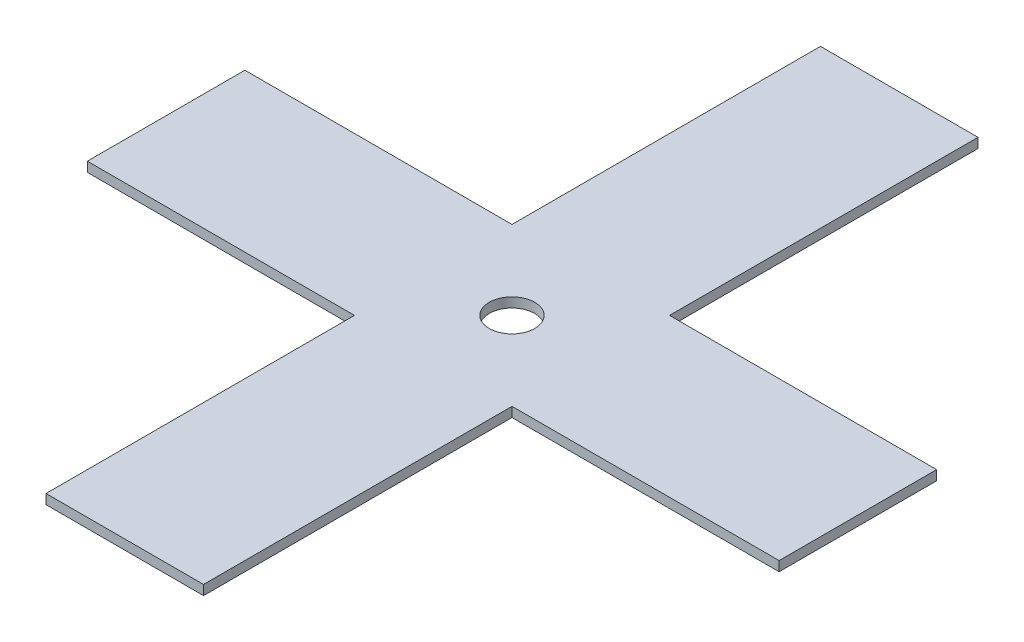
ISO-10303-21;
HEADER;
FILE_DESCRIPTION(('STEP AP214'),'2;1');
FILE_NAME('part.step','',(''),(''),'','','');
FILE_SCHEMA(('AUTOMOTIVE_DESIGN { 1 0 10303 214 1 1 1 1 }'));
ENDSEC;
DATA;
#1=APPLICATION_CONTEXT('core data for automotive mechanical design processes');
#2=APPLICATION_PROTOCOL_DEFINITION('international standard','automotive_design',2000,#1);
#3=PRODUCT_CONTEXT('',#1,'mechanical');
#4=PRODUCT('Part','Part','',(#3));
#5=PRODUCT_RELATED_PRODUCT_CATEGORY('part','',(#4));
#6=PRODUCT_DEFINITION_FORMATION('','',#4);
#7=PRODUCT_DEFINITION_CONTEXT('part definition',#1,'design');
#8=PRODUCT_DEFINITION('design','',#6,#7);
#9=PRODUCT_DEFINITION_SHAPE('','',#8);
#10=(LENGTH_UNIT() NAMED_UNIT(*) SI_UNIT(.MILLI.,.METRE.));
#11=(NAMED_UNIT(*) PLANE_ANGLE_UNIT() SI_UNIT($,.RADIAN.));
#12=(NAMED_UNIT(*) SI_UNIT($,.STERADIAN.) SOLID_ANGLE_UNIT());
#13=UNCERTAINTY_MEASURE_WITH_UNIT(LENGTH_MEASURE(1.E-05),#10,'distance_accuracy_value','');
#14=(GEOMETRIC_REPRESENTATION_CONTEXT(3) GLOBAL_UNCERTAINTY_ASSIGNED_CONTEXT((#13)) GLOBAL_UNIT_ASSIGNED_CONTEXT((#10,
#11,#12)) REPRESENTATION_CONTEXT('',''));
#15=CARTESIAN_POINT('',(0.,0.,0.));
#16=DIRECTION('',(0.,0.,1.));
#17=DIRECTION('',(1.,0.,0.));
#18=AXIS2_PLACEMENT_3D('',#15,#16,#17);
#19=CARTESIAN_POINT('',(0.,1.175,0.));
#20=DIRECTION('',(0.,-1.,0.));
#21=DIRECTION('',(0.,0.,-1.));
#22=AXIS2_PLACEMENT_3D('',#19,#20,#21);
#23=PLANE('',#22);
#24=DIRECTION('',(1.,0.,0.));
#25=VECTOR('',#24,1.);
#26=CARTESIAN_POINT('',(19.05,1.175,0.));
#27=LINE('',#26,#25);
#28=CARTESIAN_POINT('',(0.,1.175,0.));
#29=VERTEX_POINT('',#28);
#30=CARTESIAN_POINT('',(19.05,1.175,0.));
#31=VERTEX_POINT('',#30);
#32=EDGE_CURVE('E177',#29,#31,#27,.T.);
#33=ORIENTED_EDGE('',*,*,#32,.T.);
#34=DIRECTION('',(0.,0.,-1.));
#35=VECTOR('',#34,1.);
#36=CARTESIAN_POINT('',(19.05,1.175,-37.3));
#37=LINE('',#36,#35);
#38=CARTESIAN_POINT('',(19.05,1.175,-37.3));
#39=VERTEX_POINT('',#38);
#40=EDGE_CURVE('E105',#31,#39,#37,.T.);
#41=ORIENTED_EDGE('',*,*,#40,.T.);
#42=DIRECTION('',(1.,0.,0.));
#43=VECTOR('',#42,1.);
#44=CARTESIAN_POINT('',(51.35,1.175,-37.3));
#45=LINE('',#44,#43);
#46=CARTESIAN_POINT('',(51.35,1.175,-37.3));
#47=VERTEX_POINT('',#46);
#48=EDGE_CURVE('E204',#39,#47,#45,.T.);
#49=ORIENTED_EDGE('',*,*,#48,.T.);
#50=DIRECTION('',(0.,0.,-1.));
#51=VECTOR('',#50,1.);
#52=CARTESIAN_POINT('',(51.35,1.175,-56.35));
#53=LINE('',#52,#51);
#54=CARTESIAN_POINT('',(51.35,1.175,-56.35));
#55=VERTEX_POINT('',#54);
#56=EDGE_CURVE('E223',#47,#55,#53,.T.);
#57=ORIENTED_EDGE('',*,*,#56,.T.);
#58=DIRECTION('',(-1.,0.,0.));
#59=VECTOR('',#58,1.);
#60=CARTESIAN_POINT('',(19.05,1.175,-56.35));
#61=LINE('',#60,#59);
#62=CARTESIAN_POINT('',(19.05,1.175,-56.35));
#63=VERTEX_POINT('',#62);
#64=EDGE_CURVE('E220',#55,#63,#61,.T.);
#65=ORIENTED_EDGE('',*,*,#64,.T.);
#66=DIRECTION('',(0.,0.,-1.));
#67=VECTOR('',#66,1.);
#68=CARTESIAN_POINT('',(19.05,1.175,-93.65));
#69=LINE('',#68,#67);
#70=CARTESIAN_POINT('',(19.05,1.175,-93.65));
#71=VERTEX_POINT('',#70);
#72=EDGE_CURVE('E222',#63,#71,#69,.T.);
#73=ORIENTED_EDGE('',*,*,#72,.T.);
#74=DIRECTION('',(-1.,0.,0.));
#75=VECTOR('',#74,1.);
#76=CARTESIAN_POINT('',(0.,1.175,-93.65));
#77=LINE('',#76,#75);
#78=CARTESIAN_POINT('',(0.,1.175,-93.65));
#79=VERTEX_POINT('',#78);
#80=EDGE_CURVE('E225',#71,#79,#77,.T.);
#81=ORIENTED_EDGE('',*,*,#80,.T.);
#82=DIRECTION('',(0.,0.,1.));
#83=VECTOR('',#82,1.);
#84=CARTESIAN_POINT('',(0.,1.175,-56.35));
#85=LINE('',#84,#83);
#86=CARTESIAN_POINT('',(0.,1.175,-56.35));
#87=VERTEX_POINT('',#86);
#88=EDGE_CURVE('E231',#79,#87,#85,.T.);
#89=ORIENTED_EDGE('',*,*,#88,.T.);
#90=DIRECTION('',(-1.,0.,0.));
#91=VECTOR('',#90,1.);
#92=CARTESIAN_POINT('',(-32.3,1.175,-56.35));
#93=LINE('',#92,#91);
#94=CARTESIAN_POINT('',(-32.3,1.175,-56.35));
#95=VERTEX_POINT('',#94);
#96=EDGE_CURVE('E136',#87,#95,#93,.T.);
#97=ORIENTED_EDGE('',*,*,#96,.T.);
#98=DIRECTION('',(0.,0.,1.));
#99=VECTOR('',#98,1.);
#100=CARTESIAN_POINT('',(-32.3,1.175,-37.3));
#101=LINE('',#100,#99);
#102=CARTESIAN_POINT('',(-32.3,1.175,-37.3));
#103=VERTEX_POINT('',#102);
#104=EDGE_CURVE('E130',#95,#103,#101,.T.);
#105=ORIENTED_EDGE('',*,*,#104,.T.);
#106=DIRECTION('',(1.,0.,0.));
#107=VECTOR('',#106,1.);
#108=CARTESIAN_POINT('',(0.,1.175,-37.3));
#109=LINE('',#108,#107);
#110=CARTESIAN_POINT('',(0.,1.175,-37.3));
#111=VERTEX_POINT('',#110);
#112=EDGE_CURVE('E134',#103,#111,#109,.T.);
#113=ORIENTED_EDGE('',*,*,#112,.T.);
#114=DIRECTION('',(0.,0.,1.));
#115=VECTOR('',#114,1.);
#116=CARTESIAN_POINT('',(0.,1.175,0.));
#117=LINE('',#116,#115);
#118=EDGE_CURVE('E50',#111,#29,#117,.T.);
#119=ORIENTED_EDGE('',*,*,#118,.T.);
#120=EDGE_LOOP('',(#33,#41,#49,#57,#65,#73,#81,#89,#97,#105,#113,#119));
#121=FACE_BOUND('',#120,.T.);
#122=CARTESIAN_POINT('',(9.525,1.175,-46.825));
#123=DIRECTION('',(0.,1.,0.));
#124=DIRECTION('',(0.,0.,1.));
#125=AXIS2_PLACEMENT_3D('',#122,#123,#124);
#126=CIRCLE('',#125,2.75);
#127=CARTESIAN_POINT('',(9.525,1.175,-44.075));
#128=VERTEX_POINT('',#127);
#129=EDGE_CURVE('E158',#128,#128,#126,.T.);
#130=ORIENTED_EDGE('',*,*,#129,.F.);
#131=EDGE_LOOP('',(#130));
#132=FACE_BOUND('',#131,.T.);
#133=ADVANCED_FACE('F33',(#121,#132),#23,.F.);
#134=CARTESIAN_POINT('',(0.,0.,0.));
#135=DIRECTION('',(0.,-1.,0.));
#136=DIRECTION('',(0.,0.,-1.));
#137=AXIS2_PLACEMENT_3D('',#134,#135,#136);
#138=PLANE('',#137);
#139=DIRECTION('',(1.,0.,0.));
#140=VECTOR('',#139,1.);
#141=CARTESIAN_POINT('',(19.05,0.,0.));
#142=LINE('',#141,#140);
#143=CARTESIAN_POINT('',(0.,0.,0.));
#144=VERTEX_POINT('',#143);
#145=CARTESIAN_POINT('',(19.05,0.,0.));
#146=VERTEX_POINT('',#145);
#147=EDGE_CURVE('E154',#144,#146,#142,.T.);
#148=ORIENTED_EDGE('',*,*,#147,.F.);
#149=DIRECTION('',(0.,0.,1.));
#150=VECTOR('',#149,1.);
#151=CARTESIAN_POINT('',(0.,0.,0.));
#152=LINE('',#151,#150);
#153=CARTESIAN_POINT('',(0.,0.,-37.3));
#154=VERTEX_POINT('',#153);
#155=EDGE_CURVE('E97',#154,#144,#152,.T.);
#156=ORIENTED_EDGE('',*,*,#155,.F.);
#157=DIRECTION('',(1.,0.,0.));
#158=VECTOR('',#157,1.);
#159=CARTESIAN_POINT('',(0.,0.,-37.3));
#160=LINE('',#159,#158);
#161=CARTESIAN_POINT('',(-32.3,0.,-37.3));
#162=VERTEX_POINT('',#161);
#163=EDGE_CURVE('E91',#162,#154,#160,.T.);
#164=ORIENTED_EDGE('',*,*,#163,.F.);
#165=DIRECTION('',(0.,0.,1.));
#166=VECTOR('',#165,1.);
#167=CARTESIAN_POINT('',(-32.3,0.,-37.3));
#168=LINE('',#167,#166);
#169=CARTESIAN_POINT('',(-32.3,0.,-56.35));
#170=VERTEX_POINT('',#169);
#171=EDGE_CURVE('E144',#170,#162,#168,.T.);
#172=ORIENTED_EDGE('',*,*,#171,.F.);
#173=DIRECTION('',(-1.,0.,0.));
#174=VECTOR('',#173,1.);
#175=CARTESIAN_POINT('',(-32.3,0.,-56.35));
#176=LINE('',#175,#174);
#177=CARTESIAN_POINT('',(0.,0.,-56.35));
#178=VERTEX_POINT('',#177);
#179=EDGE_CURVE('E172',#178,#170,#176,.T.);
#180=ORIENTED_EDGE('',*,*,#179,.F.);
#181=DIRECTION('',(0.,0.,1.));
#182=VECTOR('',#181,1.);
#183=CARTESIAN_POINT('',(0.,0.,-56.35));
#184=LINE('',#183,#182);
#185=CARTESIAN_POINT('',(0.,0.,-93.65));
#186=VERTEX_POINT('',#185);
#187=EDGE_CURVE('E170',#186,#178,#184,.T.);
#188=ORIENTED_EDGE('',*,*,#187,.F.);
#189=DIRECTION('',(-1.,0.,0.));
#190=VECTOR('',#189,1.);
#191=CARTESIAN_POINT('',(0.,0.,-93.65));
#192=LINE('',#191,#190);
#193=CARTESIAN_POINT('',(19.05,0.,-93.65));
#194=VERTEX_POINT('',#193);
#195=EDGE_CURVE('E168',#194,#186,#192,.T.);
#196=ORIENTED_EDGE('',*,*,#195,.F.);
#197=DIRECTION('',(0.,0.,-1.));
#198=VECTOR('',#197,1.);
#199=CARTESIAN_POINT('',(19.05,0.,-93.65));
#200=LINE('',#199,#198);
#201=CARTESIAN_POINT('',(19.05,0.,-56.35));
#202=VERTEX_POINT('',#201);
#203=EDGE_CURVE('E166',#202,#194,#200,.T.);
#204=ORIENTED_EDGE('',*,*,#203,.F.);
#205=DIRECTION('',(-1.,0.,0.));
#206=VECTOR('',#205,1.);
#207=CARTESIAN_POINT('',(19.05,0.,-56.35));
#208=LINE('',#207,#206);
#209=CARTESIAN_POINT('',(51.35,0.,-56.35));
#210=VERTEX_POINT('',#209);
#211=EDGE_CURVE('E164',#210,#202,#208,.T.);
#212=ORIENTED_EDGE('',*,*,#211,.F.);
#213=DIRECTION('',(0.,0.,-1.));
#214=VECTOR('',#213,1.);
#215=CARTESIAN_POINT('',(51.35,0.,-56.35));
#216=LINE('',#215,#214);
#217=CARTESIAN_POINT('',(51.35,0.,-37.3));
#218=VERTEX_POINT('',#217);
#219=EDGE_CURVE('E162',#218,#210,#216,.T.);
#220=ORIENTED_EDGE('',*,*,#219,.F.);
#221=DIRECTION('',(1.,0.,0.));
#222=VECTOR('',#221,1.);
#223=CARTESIAN_POINT('',(51.35,0.,-37.3));
#224=LINE('',#223,#222);
#225=CARTESIAN_POINT('',(19.05,0.,-37.3));
#226=VERTEX_POINT('',#225);
#227=EDGE_CURVE('E160',#226,#218,#224,.T.);
#228=ORIENTED_EDGE('',*,*,#227,.F.);
#229=DIRECTION('',(0.,0.,-1.));
#230=VECTOR('',#229,1.);
#231=CARTESIAN_POINT('',(19.05,0.,-37.3));
#232=LINE('',#231,#230);
#233=EDGE_CURVE('E157',#146,#226,#232,.T.);
#234=ORIENTED_EDGE('',*,*,#233,.F.);
#235=EDGE_LOOP('',(#148,#156,#164,#172,#180,#188,#196,#204,#212,#220,#228,#234));
#236=FACE_BOUND('',#235,.T.);
#237=CARTESIAN_POINT('',(9.525,0.,-46.825));
#238=DIRECTION('',(0.,1.,0.));
#239=DIRECTION('',(0.,0.,1.));
#240=AXIS2_PLACEMENT_3D('',#237,#238,#239);
#241=CIRCLE('',#240,2.75);
#242=CARTESIAN_POINT('',(9.525,0.,-44.075));
#243=VERTEX_POINT('',#242);
#244=EDGE_CURVE('E378',#243,#243,#241,.T.);
#245=ORIENTED_EDGE('',*,*,#244,.T.);
#246=EDGE_LOOP('',(#245));
#247=FACE_BOUND('',#246,.T.);
#248=ADVANCED_FACE('F208',(#236,#247),#138,.T.);
#249=CARTESIAN_POINT('',(19.05,1.175,0.));
#250=DIRECTION('',(0.,0.,-1.));
#251=DIRECTION('',(-1.,0.,0.));
#252=AXIS2_PLACEMENT_3D('',#249,#250,#251);
#253=PLANE('',#252);
#254=ORIENTED_EDGE('',*,*,#147,.T.);
#255=DIRECTION('',(0.,-1.,0.));
#256=VECTOR('',#255,1.);
#257=CARTESIAN_POINT('',(19.05,1.175,0.));
#258=LINE('',#257,#256);
#259=EDGE_CURVE('E11',#31,#146,#258,.T.);
#260=ORIENTED_EDGE('',*,*,#259,.F.);
#261=ORIENTED_EDGE('',*,*,#32,.F.);
#262=DIRECTION('',(0.,-1.,0.));
#263=VECTOR('',#262,1.);
#264=CARTESIAN_POINT('',(0.,1.175,0.));
#265=LINE('',#264,#263);
#266=EDGE_CURVE('E150',#29,#144,#265,.T.);
#267=ORIENTED_EDGE('',*,*,#266,.T.);
#268=EDGE_LOOP('',(#254,#260,#261,#267));
#269=FACE_BOUND('',#268,.T.);
#270=ADVANCED_FACE('F35',(#269),#253,.F.);
#271=CARTESIAN_POINT('',(19.05,1.175,-37.3));
#272=DIRECTION('',(-1.,0.,0.));
#273=DIRECTION('',(0.,0.,1.));
#274=AXIS2_PLACEMENT_3D('',#271,#272,#273);
#275=PLANE('',#274);
#276=ORIENTED_EDGE('',*,*,#233,.T.);
#277=DIRECTION('',(0.,-1.,0.));
#278=VECTOR('',#277,1.);
#279=CARTESIAN_POINT('',(19.05,1.175,-37.3));
#280=LINE('',#279,#278);
#281=EDGE_CURVE('E42',#39,#226,#280,.T.);
#282=ORIENTED_EDGE('',*,*,#281,.F.);
#283=ORIENTED_EDGE('',*,*,#40,.F.);
#284=ORIENTED_EDGE('',*,*,#259,.T.);
#285=EDGE_LOOP('',(#276,#282,#283,#284));
#286=FACE_BOUND('',#285,.T.);
#287=ADVANCED_FACE('F265',(#286),#275,.F.);
#288=CARTESIAN_POINT('',(51.35,1.175,-37.3));
#289=DIRECTION('',(0.,0.,-1.));
#290=DIRECTION('',(-1.,0.,0.));
#291=AXIS2_PLACEMENT_3D('',#288,#289,#290);
#292=PLANE('',#291);
#293=ORIENTED_EDGE('',*,*,#227,.T.);
#294=DIRECTION('',(0.,-1.,0.));
#295=VECTOR('',#294,1.);
#296=CARTESIAN_POINT('',(51.35,1.175,-37.3));
#297=LINE('',#296,#295);
#298=EDGE_CURVE('E196',#47,#218,#297,.T.);
#299=ORIENTED_EDGE('',*,*,#298,.F.);
#300=ORIENTED_EDGE('',*,*,#48,.F.);
#301=ORIENTED_EDGE('',*,*,#281,.T.);
#302=EDGE_LOOP('',(#293,#299,#300,#301));
#303=FACE_BOUND('',#302,.T.);
#304=ADVANCED_FACE('F202',(#303),#292,.F.);
#305=CARTESIAN_POINT('',(51.35,1.175,-56.35));
#306=DIRECTION('',(-1.,0.,0.));
#307=DIRECTION('',(0.,0.,1.));
#308=AXIS2_PLACEMENT_3D('',#305,#306,#307);
#309=PLANE('',#308);
#310=ORIENTED_EDGE('',*,*,#219,.T.);
#311=DIRECTION('',(0.,-1.,0.));
#312=VECTOR('',#311,1.);
#313=CARTESIAN_POINT('',(51.35,1.175,-56.35));
#314=LINE('',#313,#312);
#315=EDGE_CURVE('E193',#55,#210,#314,.T.);
#316=ORIENTED_EDGE('',*,*,#315,.F.);
#317=ORIENTED_EDGE('',*,*,#56,.F.);
#318=ORIENTED_EDGE('',*,*,#298,.T.);
#319=EDGE_LOOP('',(#310,#316,#317,#318));
#320=FACE_BOUND('',#319,.T.);
#321=ADVANCED_FACE('F214',(#320),#309,.F.);
#322=CARTESIAN_POINT('',(19.05,1.175,-56.35));
#323=DIRECTION('',(0.,0.,1.));
#324=DIRECTION('',(1.,0.,0.));
#325=AXIS2_PLACEMENT_3D('',#322,#323,#324);
#326=PLANE('',#325);
#327=ORIENTED_EDGE('',*,*,#211,.T.);
#328=DIRECTION('',(0.,-1.,0.));
#329=VECTOR('',#328,1.);
#330=CARTESIAN_POINT('',(19.05,1.175,-56.35));
#331=LINE('',#330,#329);
#332=EDGE_CURVE('E190',#63,#202,#331,.T.);
#333=ORIENTED_EDGE('',*,*,#332,.F.);
#334=ORIENTED_EDGE('',*,*,#64,.F.);
#335=ORIENTED_EDGE('',*,*,#315,.T.);
#336=EDGE_LOOP('',(#327,#333,#334,#335));
#337=FACE_BOUND('',#336,.T.);
#338=ADVANCED_FACE('F218',(#337),#326,.F.);
#339=CARTESIAN_POINT('',(19.05,1.175,-93.65));
#340=DIRECTION('',(-1.,0.,0.));
#341=DIRECTION('',(0.,0.,1.));
#342=AXIS2_PLACEMENT_3D('',#339,#340,#341);
#343=PLANE('',#342);
#344=ORIENTED_EDGE('',*,*,#203,.T.);
#345=DIRECTION('',(0.,-1.,0.));
#346=VECTOR('',#345,1.);
#347=CARTESIAN_POINT('',(19.05,1.175,-93.65));
#348=LINE('',#347,#346);
#349=EDGE_CURVE('E187',#71,#194,#348,.T.);
#350=ORIENTED_EDGE('',*,*,#349,.F.);
#351=ORIENTED_EDGE('',*,*,#72,.F.);
#352=ORIENTED_EDGE('',*,*,#332,.T.);
#353=EDGE_LOOP('',(#344,#350,#351,#352));
#354=FACE_BOUND('',#353,.T.);
#355=ADVANCED_FACE('F278',(#354),#343,.F.);
#356=CARTESIAN_POINT('',(0.,1.175,-93.65));
#357=DIRECTION('',(0.,0.,1.));
#358=DIRECTION('',(1.,0.,0.));
#359=AXIS2_PLACEMENT_3D('',#356,#357,#358);
#360=PLANE('',#359);
#361=ORIENTED_EDGE('',*,*,#195,.T.);
#362=DIRECTION('',(0.,-1.,0.));
#363=VECTOR('',#362,1.);
#364=CARTESIAN_POINT('',(0.,1.175,-93.65));
#365=LINE('',#364,#363);
#366=EDGE_CURVE('E184',#79,#186,#365,.T.);
#367=ORIENTED_EDGE('',*,*,#366,.F.);
#368=ORIENTED_EDGE('',*,*,#80,.F.);
#369=ORIENTED_EDGE('',*,*,#349,.T.);
#370=EDGE_LOOP('',(#361,#367,#368,#369));
#371=FACE_BOUND('',#370,.T.);
#372=ADVANCED_FACE('F281',(#371),#360,.F.);
#373=CARTESIAN_POINT('',(0.,1.175,-56.35));
#374=DIRECTION('',(1.,0.,0.));
#375=DIRECTION('',(0.,0.,-1.));
#376=AXIS2_PLACEMENT_3D('',#373,#374,#375);
#377=PLANE('',#376);
#378=ORIENTED_EDGE('',*,*,#187,.T.);
#379=DIRECTION('',(0.,-1.,0.));
#380=VECTOR('',#379,1.);
#381=CARTESIAN_POINT('',(0.,1.175,-56.35));
#382=LINE('',#381,#380);
#383=EDGE_CURVE('E181',#87,#178,#382,.T.);
#384=ORIENTED_EDGE('',*,*,#383,.F.);
#385=ORIENTED_EDGE('',*,*,#88,.F.);
#386=ORIENTED_EDGE('',*,*,#366,.T.);
#387=EDGE_LOOP('',(#378,#384,#385,#386));
#388=FACE_BOUND('',#387,.T.);
#389=ADVANCED_FACE('F237',(#388),#377,.F.);
#390=CARTESIAN_POINT('',(-32.3,1.175,-56.35));
#391=DIRECTION('',(0.,0.,1.));
#392=DIRECTION('',(1.,0.,0.));
#393=AXIS2_PLACEMENT_3D('',#390,#391,#392);
#394=PLANE('',#393);
#395=ORIENTED_EDGE('',*,*,#179,.T.);
#396=DIRECTION('',(0.,-1.,0.));
#397=VECTOR('',#396,1.);
#398=CARTESIAN_POINT('',(-32.3,1.175,-56.35));
#399=LINE('',#398,#397);
#400=EDGE_CURVE('E145',#95,#170,#399,.T.);
#401=ORIENTED_EDGE('',*,*,#400,.F.);
#402=ORIENTED_EDGE('',*,*,#96,.F.);
#403=ORIENTED_EDGE('',*,*,#383,.T.);
#404=EDGE_LOOP('',(#395,#401,#402,#403));
#405=FACE_BOUND('',#404,.T.);
#406=ADVANCED_FACE('F241',(#405),#394,.F.);
#407=CARTESIAN_POINT('',(-32.3,1.175,-37.3));
#408=DIRECTION('',(1.,0.,0.));
#409=DIRECTION('',(0.,0.,-1.));
#410=AXIS2_PLACEMENT_3D('',#407,#408,#409);
#411=PLANE('',#410);
#412=ORIENTED_EDGE('',*,*,#171,.T.);
#413=DIRECTION('',(0.,-1.,0.));
#414=VECTOR('',#413,1.);
#415=CARTESIAN_POINT('',(-32.3,1.175,-37.3));
#416=LINE('',#415,#414);
#417=EDGE_CURVE('E141',#103,#162,#416,.T.);
#418=ORIENTED_EDGE('',*,*,#417,.F.);
#419=ORIENTED_EDGE('',*,*,#104,.F.);
#420=ORIENTED_EDGE('',*,*,#400,.T.);
#421=EDGE_LOOP('',(#412,#418,#419,#420));
#422=FACE_BOUND('',#421,.T.);
#423=ADVANCED_FACE('F142',(#422),#411,.F.);
#424=CARTESIAN_POINT('',(0.,1.175,-37.3));
#425=DIRECTION('',(0.,0.,-1.));
#426=DIRECTION('',(-1.,0.,0.));
#427=AXIS2_PLACEMENT_3D('',#424,#425,#426);
#428=PLANE('',#427);
#429=ORIENTED_EDGE('',*,*,#163,.T.);
#430=DIRECTION('',(0.,-1.,0.));
#431=VECTOR('',#430,1.);
#432=CARTESIAN_POINT('',(0.,1.175,-37.3));
#433=LINE('',#432,#431);
#434=EDGE_CURVE('E146',#111,#154,#433,.T.);
#435=ORIENTED_EDGE('',*,*,#434,.F.);
#436=ORIENTED_EDGE('',*,*,#112,.F.);
#437=ORIENTED_EDGE('',*,*,#417,.T.);
#438=EDGE_LOOP('',(#429,#435,#436,#437));
#439=FACE_BOUND('',#438,.T.);
#440=ADVANCED_FACE('F148',(#439),#428,.F.);
#441=CARTESIAN_POINT('',(0.,1.175,0.));
#442=DIRECTION('',(1.,0.,0.));
#443=DIRECTION('',(0.,0.,-1.));
#444=AXIS2_PLACEMENT_3D('',#441,#442,#443);
#445=PLANE('',#444);
#446=ORIENTED_EDGE('',*,*,#155,.T.);
#447=ORIENTED_EDGE('',*,*,#266,.F.);
#448=ORIENTED_EDGE('',*,*,#118,.F.);
#449=ORIENTED_EDGE('',*,*,#434,.T.);
#450=EDGE_LOOP('',(#446,#447,#448,#449));
#451=FACE_BOUND('',#450,.T.);
#452=ADVANCED_FACE('F245',(#451),#445,.F.);
#453=CARTESIAN_POINT('',(9.525,1.175,-46.825));
#454=DIRECTION('',(0.,-1.,0.));
#455=DIRECTION('',(0.,0.,-1.));
#456=AXIS2_PLACEMENT_3D('',#453,#454,#455);
#457=CYLINDRICAL_SURFACE('',#456,2.75);
#458=ORIENTED_EDGE('',*,*,#129,.T.);
#459=EDGE_LOOP('',(#458));
#460=FACE_BOUND('',#459,.T.);
#461=ORIENTED_EDGE('',*,*,#244,.F.);
#462=EDGE_LOOP('',(#461));
#463=FACE_BOUND('',#462,.T.);
#464=ADVANCED_FACE('F247',(#460,#463),#457,.F.);
#465=CLOSED_SHELL('',(#133,#248,#270,#287,#304,#321,#338,#355,#372,#389,#406,#423,#440,#452,#464));
#466=MANIFOLD_SOLID_BREP('B2',#465);
#467=ADVANCED_BREP_SHAPE_REPRESENTATION('',(#18,#466),#14);
#468=SHAPE_DEFINITION_REPRESENTATION(#9,#467);
ENDSEC;
END-ISO-10303-21;
